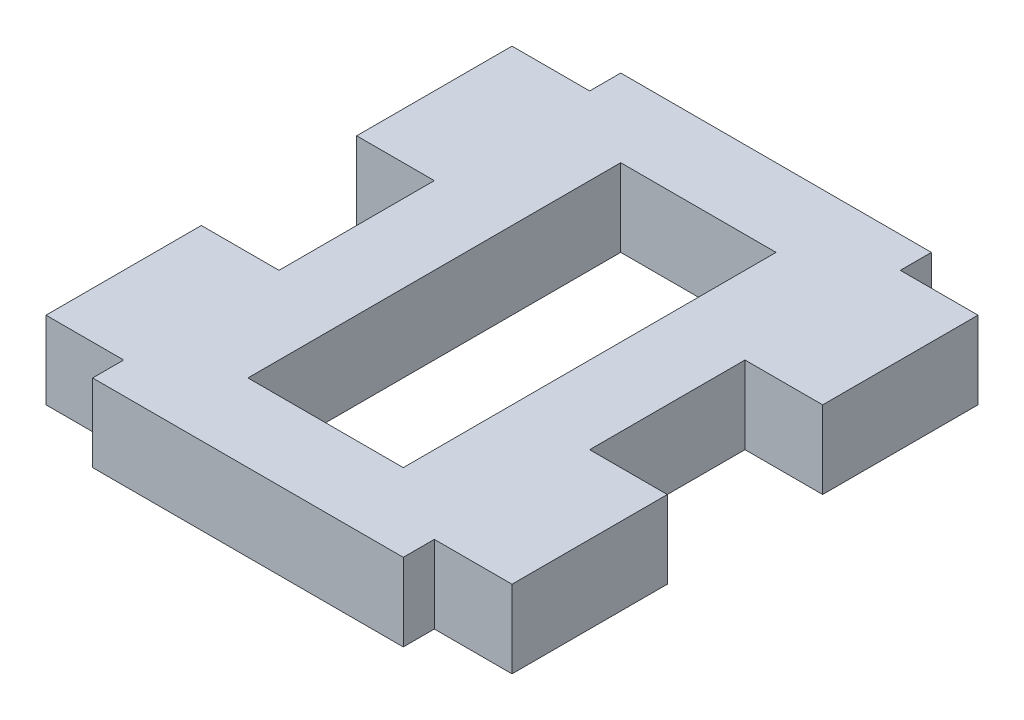
ISO-10303-21;
HEADER;
FILE_DESCRIPTION(('STEP AP214'),'2;1');
FILE_NAME('part.step','',(''),(''),'','','');
FILE_SCHEMA(('AUTOMOTIVE_DESIGN { 1 0 10303 214 1 1 1 1 }'));
ENDSEC;
DATA;
#1=APPLICATION_CONTEXT('core data for automotive mechanical design processes');
#2=APPLICATION_PROTOCOL_DEFINITION('international standard','automotive_design',2000,#1);
#3=PRODUCT_CONTEXT('',#1,'mechanical');
#4=PRODUCT('Part','Part','',(#3));
#5=PRODUCT_RELATED_PRODUCT_CATEGORY('part','',(#4));
#6=PRODUCT_DEFINITION_FORMATION('','',#4);
#7=PRODUCT_DEFINITION_CONTEXT('part definition',#1,'design');
#8=PRODUCT_DEFINITION('design','',#6,#7);
#9=PRODUCT_DEFINITION_SHAPE('','',#8);
#10=(LENGTH_UNIT() NAMED_UNIT(*) SI_UNIT(.MILLI.,.METRE.));
#11=(NAMED_UNIT(*) PLANE_ANGLE_UNIT() SI_UNIT($,.RADIAN.));
#12=(NAMED_UNIT(*) SI_UNIT($,.STERADIAN.) SOLID_ANGLE_UNIT());
#13=UNCERTAINTY_MEASURE_WITH_UNIT(LENGTH_MEASURE(1.E-05),#10,'distance_accuracy_value','');
#14=(GEOMETRIC_REPRESENTATION_CONTEXT(3) GLOBAL_UNCERTAINTY_ASSIGNED_CONTEXT((#13)) GLOBAL_UNIT_ASSIGNED_CONTEXT((#10,
#11,#12)) REPRESENTATION_CONTEXT('',''));
#15=CARTESIAN_POINT('',(0.,0.,0.));
#16=DIRECTION('',(0.,0.,1.));
#17=DIRECTION('',(1.,0.,0.));
#18=AXIS2_PLACEMENT_3D('',#15,#16,#17);
#19=CARTESIAN_POINT('',(12.7,6.35,21.59));
#20=DIRECTION('',(-1.,0.,0.));
#21=DIRECTION('',(0.,0.,1.));
#22=AXIS2_PLACEMENT_3D('',#19,#20,#21);
#23=PLANE('',#22);
#24=DIRECTION('',(0.,-1.,0.));
#25=VECTOR('',#24,1.);
#26=CARTESIAN_POINT('',(12.7,20.5490316571237,-6.35000000000001));
#27=LINE('',#26,#25);
#28=CARTESIAN_POINT('',(12.7,6.35,-6.35000000000001));
#29=VERTEX_POINT('',#28);
#30=CARTESIAN_POINT('',(12.7,0.,-6.35000000000001));
#31=VERTEX_POINT('',#30);
#32=EDGE_CURVE('E276',#29,#31,#27,.T.);
#33=ORIENTED_EDGE('',*,*,#32,.F.);
#34=DIRECTION('',(0.,0.,-1.));
#35=VECTOR('',#34,1.);
#36=CARTESIAN_POINT('',(12.7,6.35,21.59));
#37=LINE('',#36,#35);
#38=CARTESIAN_POINT('',(12.7,6.35,6.35000000000001));
#39=VERTEX_POINT('',#38);
#40=EDGE_CURVE('E341',#39,#29,#37,.T.);
#41=ORIENTED_EDGE('',*,*,#40,.F.);
#42=DIRECTION('',(0.,-1.,0.));
#43=VECTOR('',#42,1.);
#44=CARTESIAN_POINT('',(12.7,20.5490316571237,6.35000000000001));
#45=LINE('',#44,#43);
#46=CARTESIAN_POINT('',(12.7,0.,6.35000000000001));
#47=VERTEX_POINT('',#46);
#48=EDGE_CURVE('E249',#39,#47,#45,.T.);
#49=ORIENTED_EDGE('',*,*,#48,.T.);
#50=DIRECTION('',(0.,0.,-1.));
#51=VECTOR('',#50,1.);
#52=CARTESIAN_POINT('',(12.7,0.,21.59));
#53=LINE('',#52,#51);
#54=EDGE_CURVE('E355',#47,#31,#53,.T.);
#55=ORIENTED_EDGE('',*,*,#54,.T.);
#56=EDGE_LOOP('',(#33,#41,#49,#55));
#57=FACE_BOUND('',#56,.T.);
#58=ADVANCED_FACE('F39',(#57),#23,.F.);
#59=DIRECTION('',(0.,-1.,0.));
#60=VECTOR('',#59,1.);
#61=CARTESIAN_POINT('',(12.7,20.5490316571237,19.05));
#62=LINE('',#61,#60);
#63=CARTESIAN_POINT('',(12.7,6.35,19.05));
#64=VERTEX_POINT('',#63);
#65=CARTESIAN_POINT('',(12.7,0.,19.05));
#66=VERTEX_POINT('',#65);
#67=EDGE_CURVE('E246',#64,#66,#62,.T.);
#68=ORIENTED_EDGE('',*,*,#67,.F.);
#69=CARTESIAN_POINT('',(12.7,6.35,21.59));
#70=VERTEX_POINT('',#69);
#71=EDGE_CURVE('E337',#70,#64,#37,.T.);
#72=ORIENTED_EDGE('',*,*,#71,.F.);
#73=DIRECTION('',(0.,-1.,0.));
#74=VECTOR('',#73,1.);
#75=CARTESIAN_POINT('',(12.7,6.35,21.59));
#76=LINE('',#75,#74);
#77=CARTESIAN_POINT('',(12.7,0.,21.59));
#78=VERTEX_POINT('',#77);
#79=EDGE_CURVE('E351',#70,#78,#76,.T.);
#80=ORIENTED_EDGE('',*,*,#79,.T.);
#81=EDGE_CURVE('E352',#78,#66,#53,.T.);
#82=ORIENTED_EDGE('',*,*,#81,.T.);
#83=EDGE_LOOP('',(#68,#72,#80,#82));
#84=FACE_BOUND('',#83,.T.);
#85=ADVANCED_FACE('F423',(#84),#23,.F.);
#86=CARTESIAN_POINT('',(-12.7,6.35,21.59));
#87=DIRECTION('',(1.,0.,0.));
#88=DIRECTION('',(0.,0.,-1.));
#89=AXIS2_PLACEMENT_3D('',#86,#87,#88);
#90=PLANE('',#89);
#91=DIRECTION('',(0.,-1.,0.));
#92=VECTOR('',#91,1.);
#93=CARTESIAN_POINT('',(-12.7,20.5490316571237,-19.05));
#94=LINE('',#93,#92);
#95=CARTESIAN_POINT('',(-12.7,6.35,-19.05));
#96=VERTEX_POINT('',#95);
#97=CARTESIAN_POINT('',(-12.7,0.,-19.05));
#98=VERTEX_POINT('',#97);
#99=EDGE_CURVE('E296',#96,#98,#94,.T.);
#100=ORIENTED_EDGE('',*,*,#99,.F.);
#101=DIRECTION('',(0.,0.,1.));
#102=VECTOR('',#101,1.);
#103=CARTESIAN_POINT('',(-12.7,6.35,21.59));
#104=LINE('',#103,#102);
#105=CARTESIAN_POINT('',(-12.7,6.35,-21.59));
#106=VERTEX_POINT('',#105);
#107=EDGE_CURVE('E345',#106,#96,#104,.T.);
#108=ORIENTED_EDGE('',*,*,#107,.F.);
#109=DIRECTION('',(0.,-1.,0.));
#110=VECTOR('',#109,1.);
#111=CARTESIAN_POINT('',(-12.7,6.35,-21.59));
#112=LINE('',#111,#110);
#113=CARTESIAN_POINT('',(-12.7,0.,-21.59));
#114=VERTEX_POINT('',#113);
#115=EDGE_CURVE('E47',#106,#114,#112,.T.);
#116=ORIENTED_EDGE('',*,*,#115,.T.);
#117=DIRECTION('',(0.,0.,1.));
#118=VECTOR('',#117,1.);
#119=CARTESIAN_POINT('',(-12.7,0.,21.59));
#120=LINE('',#119,#118);
#121=EDGE_CURVE('E358',#114,#98,#120,.T.);
#122=ORIENTED_EDGE('',*,*,#121,.T.);
#123=EDGE_LOOP('',(#100,#108,#116,#122));
#124=FACE_BOUND('',#123,.T.);
#125=ADVANCED_FACE('F372',(#124),#90,.F.);
#126=CARTESIAN_POINT('',(-12.7,6.35,-6.35));
#127=VERTEX_POINT('',#126);
#128=CARTESIAN_POINT('',(-12.7,6.35,6.35));
#129=VERTEX_POINT('',#128);
#130=EDGE_CURVE('E349',#127,#129,#104,.T.);
#131=ORIENTED_EDGE('',*,*,#130,.F.);
#132=DIRECTION('',(0.,-1.,0.));
#133=VECTOR('',#132,1.);
#134=CARTESIAN_POINT('',(-12.7,20.5490316571237,-6.35));
#135=LINE('',#134,#133);
#136=CARTESIAN_POINT('',(-12.7,0.,-6.35));
#137=VERTEX_POINT('',#136);
#138=EDGE_CURVE('E299',#127,#137,#135,.T.);
#139=ORIENTED_EDGE('',*,*,#138,.T.);
#140=CARTESIAN_POINT('',(-12.7,0.,6.35));
#141=VERTEX_POINT('',#140);
#142=EDGE_CURVE('E361',#137,#141,#120,.T.);
#143=ORIENTED_EDGE('',*,*,#142,.T.);
#144=DIRECTION('',(0.,-1.,0.));
#145=VECTOR('',#144,1.);
#146=CARTESIAN_POINT('',(-12.7,20.5490316571237,6.35));
#147=LINE('',#146,#145);
#148=EDGE_CURVE('E315',#129,#141,#147,.T.);
#149=ORIENTED_EDGE('',*,*,#148,.F.);
#150=EDGE_LOOP('',(#131,#139,#143,#149));
#151=FACE_BOUND('',#150,.T.);
#152=ADVANCED_FACE('F450',(#151),#90,.F.);
#153=CARTESIAN_POINT('',(12.7,6.35,-19.05));
#154=VERTEX_POINT('',#153);
#155=CARTESIAN_POINT('',(12.7,6.35,-21.59));
#156=VERTEX_POINT('',#155);
#157=EDGE_CURVE('E342',#154,#156,#37,.T.);
#158=ORIENTED_EDGE('',*,*,#157,.F.);
#159=DIRECTION('',(0.,-1.,0.));
#160=VECTOR('',#159,1.);
#161=CARTESIAN_POINT('',(12.7,20.5490316571237,-19.05));
#162=LINE('',#161,#160);
#163=CARTESIAN_POINT('',(12.7,0.,-19.05));
#164=VERTEX_POINT('',#163);
#165=EDGE_CURVE('E269',#154,#164,#162,.T.);
#166=ORIENTED_EDGE('',*,*,#165,.T.);
#167=CARTESIAN_POINT('',(12.7,0.,-21.59));
#168=VERTEX_POINT('',#167);
#169=EDGE_CURVE('E336',#164,#168,#53,.T.);
#170=ORIENTED_EDGE('',*,*,#169,.T.);
#171=DIRECTION('',(0.,-1.,0.));
#172=VECTOR('',#171,1.);
#173=CARTESIAN_POINT('',(12.7,6.35,-21.59));
#174=LINE('',#173,#172);
#175=EDGE_CURVE('E11',#156,#168,#174,.T.);
#176=ORIENTED_EDGE('',*,*,#175,.F.);
#177=EDGE_LOOP('',(#158,#166,#170,#176));
#178=FACE_BOUND('',#177,.T.);
#179=ADVANCED_FACE('F41',(#178),#23,.F.);
#180=CARTESIAN_POINT('',(-12.7,6.35,-21.59));
#181=DIRECTION('',(0.,0.,1.));
#182=DIRECTION('',(1.,0.,0.));
#183=AXIS2_PLACEMENT_3D('',#180,#181,#182);
#184=PLANE('',#183);
#185=DIRECTION('',(-1.,0.,0.));
#186=VECTOR('',#185,1.);
#187=CARTESIAN_POINT('',(-12.7,0.,-21.59));
#188=LINE('',#187,#186);
#189=EDGE_CURVE('E354',#168,#114,#188,.T.);
#190=ORIENTED_EDGE('',*,*,#189,.T.);
#191=ORIENTED_EDGE('',*,*,#115,.F.);
#192=DIRECTION('',(-1.,0.,0.));
#193=VECTOR('',#192,1.);
#194=CARTESIAN_POINT('',(-12.7,6.35,-21.59));
#195=LINE('',#194,#193);
#196=EDGE_CURVE('E340',#156,#106,#195,.T.);
#197=ORIENTED_EDGE('',*,*,#196,.F.);
#198=ORIENTED_EDGE('',*,*,#175,.T.);
#199=EDGE_LOOP('',(#190,#191,#197,#198));
#200=FACE_BOUND('',#199,.T.);
#201=ADVANCED_FACE('F388',(#200),#184,.F.);
#202=CARTESIAN_POINT('',(-12.7,6.35,19.05));
#203=VERTEX_POINT('',#202);
#204=CARTESIAN_POINT('',(-12.7,6.35,21.59));
#205=VERTEX_POINT('',#204);
#206=EDGE_CURVE('E344',#203,#205,#104,.T.);
#207=ORIENTED_EDGE('',*,*,#206,.F.);
#208=DIRECTION('',(0.,-1.,0.));
#209=VECTOR('',#208,1.);
#210=CARTESIAN_POINT('',(-12.7,20.5490316571237,19.05));
#211=LINE('',#210,#209);
#212=CARTESIAN_POINT('',(-12.7,0.,19.05));
#213=VERTEX_POINT('',#212);
#214=EDGE_CURVE('E326',#203,#213,#211,.T.);
#215=ORIENTED_EDGE('',*,*,#214,.T.);
#216=CARTESIAN_POINT('',(-12.7,0.,21.59));
#217=VERTEX_POINT('',#216);
#218=EDGE_CURVE('E357',#213,#217,#120,.T.);
#219=ORIENTED_EDGE('',*,*,#218,.T.);
#220=DIRECTION('',(0.,-1.,0.));
#221=VECTOR('',#220,1.);
#222=CARTESIAN_POINT('',(-12.7,6.35,21.59));
#223=LINE('',#222,#221);
#224=EDGE_CURVE('E365',#205,#217,#223,.T.);
#225=ORIENTED_EDGE('',*,*,#224,.F.);
#226=EDGE_LOOP('',(#207,#215,#219,#225));
#227=FACE_BOUND('',#226,.T.);
#228=ADVANCED_FACE('F479',(#227),#90,.F.);
#229=CARTESIAN_POINT('',(-12.7,6.35,21.59));
#230=DIRECTION('',(0.,0.,-1.));
#231=DIRECTION('',(-1.,0.,0.));
#232=AXIS2_PLACEMENT_3D('',#229,#230,#231);
#233=PLANE('',#232);
#234=DIRECTION('',(1.,0.,0.));
#235=VECTOR('',#234,1.);
#236=CARTESIAN_POINT('',(-12.7,0.,21.59));
#237=LINE('',#236,#235);
#238=EDGE_CURVE('E360',#217,#78,#237,.T.);
#239=ORIENTED_EDGE('',*,*,#238,.T.);
#240=ORIENTED_EDGE('',*,*,#79,.F.);
#241=DIRECTION('',(1.,0.,0.));
#242=VECTOR('',#241,1.);
#243=CARTESIAN_POINT('',(-12.7,6.35,21.59));
#244=LINE('',#243,#242);
#245=EDGE_CURVE('E348',#205,#70,#244,.T.);
#246=ORIENTED_EDGE('',*,*,#245,.F.);
#247=ORIENTED_EDGE('',*,*,#224,.T.);
#248=EDGE_LOOP('',(#239,#240,#246,#247));
#249=FACE_BOUND('',#248,.T.);
#250=ADVANCED_FACE('F428',(#249),#233,.F.);
#251=CARTESIAN_POINT('',(0.,6.35,0.));
#252=DIRECTION('',(0.,-1.,0.));
#253=DIRECTION('',(0.,0.,-1.));
#254=AXIS2_PLACEMENT_3D('',#251,#252,#253);
#255=PLANE('',#254);
#256=DIRECTION('',(1.,0.,0.));
#257=VECTOR('',#256,1.);
#258=CARTESIAN_POINT('',(-6.35,6.35,-15.24));
#259=LINE('',#258,#257);
#260=CARTESIAN_POINT('',(-6.35,6.35,-15.24));
#261=VERTEX_POINT('',#260);
#262=CARTESIAN_POINT('',(6.35,6.35,-15.24));
#263=VERTEX_POINT('',#262);
#264=EDGE_CURVE('E208',#261,#263,#259,.T.);
#265=ORIENTED_EDGE('',*,*,#264,.T.);
#266=DIRECTION('',(0.,0.,1.));
#267=VECTOR('',#266,1.);
#268=CARTESIAN_POINT('',(6.35,6.35,-15.24));
#269=LINE('',#268,#267);
#270=CARTESIAN_POINT('',(6.35,6.35,15.24));
#271=VERTEX_POINT('',#270);
#272=EDGE_CURVE('E202',#263,#271,#269,.T.);
#273=ORIENTED_EDGE('',*,*,#272,.T.);
#274=DIRECTION('',(-1.,0.,0.));
#275=VECTOR('',#274,1.);
#276=CARTESIAN_POINT('',(-6.35,6.35,15.24));
#277=LINE('',#276,#275);
#278=CARTESIAN_POINT('',(-6.35,6.35,15.24));
#279=VERTEX_POINT('',#278);
#280=EDGE_CURVE('E211',#271,#279,#277,.T.);
#281=ORIENTED_EDGE('',*,*,#280,.T.);
#282=DIRECTION('',(0.,0.,-1.));
#283=VECTOR('',#282,1.);
#284=CARTESIAN_POINT('',(-6.35,6.35,-15.24));
#285=LINE('',#284,#283);
#286=EDGE_CURVE('E54',#279,#261,#285,.T.);
#287=ORIENTED_EDGE('',*,*,#286,.T.);
#288=EDGE_LOOP('',(#265,#273,#281,#287));
#289=FACE_BOUND('',#288,.T.);
#290=ORIENTED_EDGE('',*,*,#71,.T.);
#291=DIRECTION('',(1.,0.,0.));
#292=VECTOR('',#291,1.);
#293=CARTESIAN_POINT('',(12.7,6.35,19.05));
#294=LINE('',#293,#292);
#295=CARTESIAN_POINT('',(19.05,6.35,19.05));
#296=VERTEX_POINT('',#295);
#297=EDGE_CURVE('E251',#64,#296,#294,.T.);
#298=ORIENTED_EDGE('',*,*,#297,.T.);
#299=DIRECTION('',(0.,0.,-1.));
#300=VECTOR('',#299,1.);
#301=CARTESIAN_POINT('',(19.05,6.35,19.05));
#302=LINE('',#301,#300);
#303=CARTESIAN_POINT('',(19.05,6.35,6.35000000000001));
#304=VERTEX_POINT('',#303);
#305=EDGE_CURVE('E237',#296,#304,#302,.T.);
#306=ORIENTED_EDGE('',*,*,#305,.T.);
#307=DIRECTION('',(-1.,0.,0.));
#308=VECTOR('',#307,1.);
#309=CARTESIAN_POINT('',(19.05,6.35,6.35000000000001));
#310=LINE('',#309,#308);
#311=EDGE_CURVE('E239',#304,#39,#310,.T.);
#312=ORIENTED_EDGE('',*,*,#311,.T.);
#313=ORIENTED_EDGE('',*,*,#40,.T.);
#314=DIRECTION('',(1.,0.,0.));
#315=VECTOR('',#314,1.);
#316=CARTESIAN_POINT('',(19.05,6.35,-6.35000000000001));
#317=LINE('',#316,#315);
#318=CARTESIAN_POINT('',(19.05,6.35,-6.35000000000001));
#319=VERTEX_POINT('',#318);
#320=EDGE_CURVE('E267',#29,#319,#317,.T.);
#321=ORIENTED_EDGE('',*,*,#320,.T.);
#322=DIRECTION('',(0.,0.,-1.));
#323=VECTOR('',#322,1.);
#324=CARTESIAN_POINT('',(19.05,6.35,-19.05));
#325=LINE('',#324,#323);
#326=CARTESIAN_POINT('',(19.05,6.35,-19.05));
#327=VERTEX_POINT('',#326);
#328=EDGE_CURVE('E279',#319,#327,#325,.T.);
#329=ORIENTED_EDGE('',*,*,#328,.T.);
#330=DIRECTION('',(-1.,0.,0.));
#331=VECTOR('',#330,1.);
#332=CARTESIAN_POINT('',(12.7,6.35,-19.05));
#333=LINE('',#332,#331);
#334=EDGE_CURVE('E264',#327,#154,#333,.T.);
#335=ORIENTED_EDGE('',*,*,#334,.T.);
#336=ORIENTED_EDGE('',*,*,#157,.T.);
#337=ORIENTED_EDGE('',*,*,#196,.T.);
#338=ORIENTED_EDGE('',*,*,#107,.T.);
#339=DIRECTION('',(-1.,0.,0.));
#340=VECTOR('',#339,1.);
#341=CARTESIAN_POINT('',(-12.7,6.35,-19.05));
#342=LINE('',#341,#340);
#343=CARTESIAN_POINT('',(-19.05,6.35,-19.05));
#344=VERTEX_POINT('',#343);
#345=EDGE_CURVE('E301',#96,#344,#342,.T.);
#346=ORIENTED_EDGE('',*,*,#345,.T.);
#347=DIRECTION('',(0.,0.,1.));
#348=VECTOR('',#347,1.);
#349=CARTESIAN_POINT('',(-19.05,6.35,-19.05));
#350=LINE('',#349,#348);
#351=CARTESIAN_POINT('',(-19.05,6.35,-6.35));
#352=VERTEX_POINT('',#351);
#353=EDGE_CURVE('E233',#344,#352,#350,.T.);
#354=ORIENTED_EDGE('',*,*,#353,.T.);
#355=DIRECTION('',(1.,0.,0.));
#356=VECTOR('',#355,1.);
#357=CARTESIAN_POINT('',(-19.05,6.35,-6.35));
#358=LINE('',#357,#356);
#359=EDGE_CURVE('E290',#352,#127,#358,.T.);
#360=ORIENTED_EDGE('',*,*,#359,.T.);
#361=ORIENTED_EDGE('',*,*,#130,.T.);
#362=DIRECTION('',(-1.,0.,0.));
#363=VECTOR('',#362,1.);
#364=CARTESIAN_POINT('',(-19.05,6.35,6.35));
#365=LINE('',#364,#363);
#366=CARTESIAN_POINT('',(-19.05,6.35,6.35));
#367=VERTEX_POINT('',#366);
#368=EDGE_CURVE('E314',#129,#367,#365,.T.);
#369=ORIENTED_EDGE('',*,*,#368,.T.);
#370=DIRECTION('',(0.,0.,1.));
#371=VECTOR('',#370,1.);
#372=CARTESIAN_POINT('',(-19.05,6.35,19.05));
#373=LINE('',#372,#371);
#374=CARTESIAN_POINT('',(-19.05,6.35,19.05));
#375=VERTEX_POINT('',#374);
#376=EDGE_CURVE('E312',#367,#375,#373,.T.);
#377=ORIENTED_EDGE('',*,*,#376,.T.);
#378=DIRECTION('',(1.,0.,0.));
#379=VECTOR('',#378,1.);
#380=CARTESIAN_POINT('',(-12.7,6.35,19.05));
#381=LINE('',#380,#379);
#382=EDGE_CURVE('E317',#375,#203,#381,.T.);
#383=ORIENTED_EDGE('',*,*,#382,.T.);
#384=ORIENTED_EDGE('',*,*,#206,.T.);
#385=ORIENTED_EDGE('',*,*,#245,.T.);
#386=EDGE_LOOP('',(#290,#298,#306,#312,#313,#321,#329,#335,#336,#337,#338,#346,#354,#360,#361,
#369,#377,#383,#384,#385));
#387=FACE_BOUND('',#386,.T.);
#388=ADVANCED_FACE('F215',(#289,#387),#255,.F.);
#389=CARTESIAN_POINT('',(0.,0.,0.));
#390=DIRECTION('',(0.,-1.,0.));
#391=DIRECTION('',(0.,0.,-1.));
#392=AXIS2_PLACEMENT_3D('',#389,#390,#391);
#393=PLANE('',#392);
#394=DIRECTION('',(0.,0.,1.));
#395=VECTOR('',#394,1.);
#396=CARTESIAN_POINT('',(6.35,0.,-15.24));
#397=LINE('',#396,#395);
#398=CARTESIAN_POINT('',(6.35,0.,-15.24));
#399=VERTEX_POINT('',#398);
#400=CARTESIAN_POINT('',(6.35,0.,15.24));
#401=VERTEX_POINT('',#400);
#402=EDGE_CURVE('E62',#399,#401,#397,.T.);
#403=ORIENTED_EDGE('',*,*,#402,.F.);
#404=DIRECTION('',(1.,0.,0.));
#405=VECTOR('',#404,1.);
#406=CARTESIAN_POINT('',(-6.35,0.,-15.24));
#407=LINE('',#406,#405);
#408=CARTESIAN_POINT('',(-6.35,0.,-15.24));
#409=VERTEX_POINT('',#408);
#410=EDGE_CURVE('E218',#409,#399,#407,.T.);
#411=ORIENTED_EDGE('',*,*,#410,.F.);
#412=DIRECTION('',(0.,0.,-1.));
#413=VECTOR('',#412,1.);
#414=CARTESIAN_POINT('',(-6.35,0.,-15.24));
#415=LINE('',#414,#413);
#416=CARTESIAN_POINT('',(-6.35,0.,15.24));
#417=VERTEX_POINT('',#416);
#418=EDGE_CURVE('E221',#417,#409,#415,.T.);
#419=ORIENTED_EDGE('',*,*,#418,.F.);
#420=DIRECTION('',(-1.,0.,0.));
#421=VECTOR('',#420,1.);
#422=CARTESIAN_POINT('',(-6.35,0.,15.24));
#423=LINE('',#422,#421);
#424=EDGE_CURVE('E227',#401,#417,#423,.T.);
#425=ORIENTED_EDGE('',*,*,#424,.F.);
#426=EDGE_LOOP('',(#403,#411,#419,#425));
#427=FACE_BOUND('',#426,.T.);
#428=ORIENTED_EDGE('',*,*,#81,.F.);
#429=ORIENTED_EDGE('',*,*,#238,.F.);
#430=ORIENTED_EDGE('',*,*,#218,.F.);
#431=DIRECTION('',(-1.,0.,0.));
#432=VECTOR('',#431,1.);
#433=CARTESIAN_POINT('',(-12.7,0.,19.05));
#434=LINE('',#433,#432);
#435=CARTESIAN_POINT('',(-19.05,0.,19.05));
#436=VERTEX_POINT('',#435);
#437=EDGE_CURVE('E260',#213,#436,#434,.T.);
#438=ORIENTED_EDGE('',*,*,#437,.T.);
#439=DIRECTION('',(0.,0.,-1.));
#440=VECTOR('',#439,1.);
#441=CARTESIAN_POINT('',(-19.05,0.,19.05));
#442=LINE('',#441,#440);
#443=CARTESIAN_POINT('',(-19.05,0.,6.35));
#444=VERTEX_POINT('',#443);
#445=EDGE_CURVE('E320',#436,#444,#442,.T.);
#446=ORIENTED_EDGE('',*,*,#445,.T.);
#447=DIRECTION('',(1.,0.,0.));
#448=VECTOR('',#447,1.);
#449=CARTESIAN_POINT('',(-19.05,0.,6.35));
#450=LINE('',#449,#448);
#451=EDGE_CURVE('E323',#444,#141,#450,.T.);
#452=ORIENTED_EDGE('',*,*,#451,.T.);
#453=ORIENTED_EDGE('',*,*,#142,.F.);
#454=DIRECTION('',(-1.,0.,0.));
#455=VECTOR('',#454,1.);
#456=CARTESIAN_POINT('',(-19.05,0.,-6.35));
#457=LINE('',#456,#455);
#458=CARTESIAN_POINT('',(-19.05,0.,-6.35));
#459=VERTEX_POINT('',#458);
#460=EDGE_CURVE('E268',#137,#459,#457,.T.);
#461=ORIENTED_EDGE('',*,*,#460,.T.);
#462=DIRECTION('',(0.,0.,-1.));
#463=VECTOR('',#462,1.);
#464=CARTESIAN_POINT('',(-19.05,0.,-19.05));
#465=LINE('',#464,#463);
#466=CARTESIAN_POINT('',(-19.05,0.,-19.05));
#467=VERTEX_POINT('',#466);
#468=EDGE_CURVE('E304',#459,#467,#465,.T.);
#469=ORIENTED_EDGE('',*,*,#468,.T.);
#470=DIRECTION('',(1.,0.,0.));
#471=VECTOR('',#470,1.);
#472=CARTESIAN_POINT('',(-12.7,0.,-19.05));
#473=LINE('',#472,#471);
#474=EDGE_CURVE('E293',#467,#98,#473,.T.);
#475=ORIENTED_EDGE('',*,*,#474,.T.);
#476=ORIENTED_EDGE('',*,*,#121,.F.);
#477=ORIENTED_EDGE('',*,*,#189,.F.);
#478=ORIENTED_EDGE('',*,*,#169,.F.);
#479=DIRECTION('',(1.,0.,0.));
#480=VECTOR('',#479,1.);
#481=CARTESIAN_POINT('',(12.7,0.,-19.05));
#482=LINE('',#481,#480);
#483=CARTESIAN_POINT('',(19.05,0.,-19.05));
#484=VERTEX_POINT('',#483);
#485=EDGE_CURVE('E240',#164,#484,#482,.T.);
#486=ORIENTED_EDGE('',*,*,#485,.T.);
#487=DIRECTION('',(0.,0.,1.));
#488=VECTOR('',#487,1.);
#489=CARTESIAN_POINT('',(19.05,0.,-19.05));
#490=LINE('',#489,#488);
#491=CARTESIAN_POINT('',(19.05,0.,-6.35000000000001));
#492=VERTEX_POINT('',#491);
#493=EDGE_CURVE('E282',#484,#492,#490,.T.);
#494=ORIENTED_EDGE('',*,*,#493,.T.);
#495=DIRECTION('',(-1.,0.,0.));
#496=VECTOR('',#495,1.);
#497=CARTESIAN_POINT('',(19.05,0.,-6.35000000000001));
#498=LINE('',#497,#496);
#499=EDGE_CURVE('E271',#492,#31,#498,.T.);
#500=ORIENTED_EDGE('',*,*,#499,.T.);
#501=ORIENTED_EDGE('',*,*,#54,.F.);
#502=DIRECTION('',(1.,0.,0.));
#503=VECTOR('',#502,1.);
#504=CARTESIAN_POINT('',(19.05,0.,6.35000000000001));
#505=LINE('',#504,#503);
#506=CARTESIAN_POINT('',(19.05,0.,6.35000000000001));
#507=VERTEX_POINT('',#506);
#508=EDGE_CURVE('E257',#47,#507,#505,.T.);
#509=ORIENTED_EDGE('',*,*,#508,.T.);
#510=DIRECTION('',(0.,0.,1.));
#511=VECTOR('',#510,1.);
#512=CARTESIAN_POINT('',(19.05,0.,19.05));
#513=LINE('',#512,#511);
#514=CARTESIAN_POINT('',(19.05,0.,19.05));
#515=VERTEX_POINT('',#514);
#516=EDGE_CURVE('E254',#507,#515,#513,.T.);
#517=ORIENTED_EDGE('',*,*,#516,.T.);
#518=DIRECTION('',(-1.,0.,0.));
#519=VECTOR('',#518,1.);
#520=CARTESIAN_POINT('',(12.7,0.,19.05));
#521=LINE('',#520,#519);
#522=EDGE_CURVE('E243',#515,#66,#521,.T.);
#523=ORIENTED_EDGE('',*,*,#522,.T.);
#524=EDGE_LOOP('',(#428,#429,#430,#438,#446,#452,#453,#461,#469,#475,#476,#477,#478,#486,#494,
#500,#501,#509,#517,#523));
#525=FACE_BOUND('',#524,.T.);
#526=ADVANCED_FACE('F378',(#427,#525),#393,.T.);
#527=CARTESIAN_POINT('',(-19.05,20.5490316571237,6.35));
#528=DIRECTION('',(0.,0.,-1.));
#529=DIRECTION('',(-1.,0.,0.));
#530=AXIS2_PLACEMENT_3D('',#527,#528,#529);
#531=PLANE('',#530);
#532=ORIENTED_EDGE('',*,*,#368,.F.);
#533=ORIENTED_EDGE('',*,*,#148,.T.);
#534=ORIENTED_EDGE('',*,*,#451,.F.);
#535=DIRECTION('',(0.,-1.,0.));
#536=VECTOR('',#535,1.);
#537=CARTESIAN_POINT('',(-19.05,20.5490316571237,6.35));
#538=LINE('',#537,#536);
#539=EDGE_CURVE('E329',#367,#444,#538,.T.);
#540=ORIENTED_EDGE('',*,*,#539,.F.);
#541=EDGE_LOOP('',(#532,#533,#534,#540));
#542=FACE_BOUND('',#541,.T.);
#543=ADVANCED_FACE('F447',(#542),#531,.T.);
#544=CARTESIAN_POINT('',(-19.05,20.5490316571237,19.05));
#545=DIRECTION('',(-1.,0.,0.));
#546=DIRECTION('',(0.,0.,1.));
#547=AXIS2_PLACEMENT_3D('',#544,#545,#546);
#548=PLANE('',#547);
#549=ORIENTED_EDGE('',*,*,#376,.F.);
#550=ORIENTED_EDGE('',*,*,#539,.T.);
#551=ORIENTED_EDGE('',*,*,#445,.F.);
#552=DIRECTION('',(0.,-1.,0.));
#553=VECTOR('',#552,1.);
#554=CARTESIAN_POINT('',(-19.05,20.5490316571237,19.05));
#555=LINE('',#554,#553);
#556=EDGE_CURVE('E331',#375,#436,#555,.T.);
#557=ORIENTED_EDGE('',*,*,#556,.F.);
#558=EDGE_LOOP('',(#549,#550,#551,#557));
#559=FACE_BOUND('',#558,.T.);
#560=ADVANCED_FACE('F441',(#559),#548,.T.);
#561=CARTESIAN_POINT('',(-12.7,20.5490316571237,19.05));
#562=DIRECTION('',(0.,0.,1.));
#563=DIRECTION('',(1.,0.,0.));
#564=AXIS2_PLACEMENT_3D('',#561,#562,#563);
#565=PLANE('',#564);
#566=ORIENTED_EDGE('',*,*,#382,.F.);
#567=ORIENTED_EDGE('',*,*,#556,.T.);
#568=ORIENTED_EDGE('',*,*,#437,.F.);
#569=ORIENTED_EDGE('',*,*,#214,.F.);
#570=EDGE_LOOP('',(#566,#567,#568,#569));
#571=FACE_BOUND('',#570,.T.);
#572=ADVANCED_FACE('F436',(#571),#565,.T.);
#573=CARTESIAN_POINT('',(-19.05,20.5490316571237,-6.35));
#574=DIRECTION('',(0.,0.,1.));
#575=DIRECTION('',(1.,0.,0.));
#576=AXIS2_PLACEMENT_3D('',#573,#574,#575);
#577=PLANE('',#576);
#578=ORIENTED_EDGE('',*,*,#359,.F.);
#579=DIRECTION('',(0.,-1.,0.));
#580=VECTOR('',#579,1.);
#581=CARTESIAN_POINT('',(-19.05,20.5490316571237,-6.35));
#582=LINE('',#581,#580);
#583=EDGE_CURVE('E291',#352,#459,#582,.T.);
#584=ORIENTED_EDGE('',*,*,#583,.T.);
#585=ORIENTED_EDGE('',*,*,#460,.F.);
#586=ORIENTED_EDGE('',*,*,#138,.F.);
#587=EDGE_LOOP('',(#578,#584,#585,#586));
#588=FACE_BOUND('',#587,.T.);
#589=ADVANCED_FACE('F456',(#588),#577,.T.);
#590=CARTESIAN_POINT('',(-12.7,20.5490316571237,-19.05));
#591=DIRECTION('',(0.,0.,-1.));
#592=DIRECTION('',(-1.,0.,0.));
#593=AXIS2_PLACEMENT_3D('',#590,#591,#592);
#594=PLANE('',#593);
#595=ORIENTED_EDGE('',*,*,#345,.F.);
#596=ORIENTED_EDGE('',*,*,#99,.T.);
#597=ORIENTED_EDGE('',*,*,#474,.F.);
#598=DIRECTION('',(0.,-1.,0.));
#599=VECTOR('',#598,1.);
#600=CARTESIAN_POINT('',(-19.05,20.5490316571237,-19.05));
#601=LINE('',#600,#599);
#602=EDGE_CURVE('E294',#344,#467,#601,.T.);
#603=ORIENTED_EDGE('',*,*,#602,.F.);
#604=EDGE_LOOP('',(#595,#596,#597,#603));
#605=FACE_BOUND('',#604,.T.);
#606=ADVANCED_FACE('F385',(#605),#594,.T.);
#607=CARTESIAN_POINT('',(-19.05,20.5490316571237,-19.05));
#608=DIRECTION('',(-1.,0.,0.));
#609=DIRECTION('',(0.,0.,1.));
#610=AXIS2_PLACEMENT_3D('',#607,#608,#609);
#611=PLANE('',#610);
#612=ORIENTED_EDGE('',*,*,#353,.F.);
#613=ORIENTED_EDGE('',*,*,#602,.T.);
#614=ORIENTED_EDGE('',*,*,#468,.F.);
#615=ORIENTED_EDGE('',*,*,#583,.F.);
#616=EDGE_LOOP('',(#612,#613,#614,#615));
#617=FACE_BOUND('',#616,.T.);
#618=ADVANCED_FACE('F458',(#617),#611,.T.);
#619=CARTESIAN_POINT('',(19.05,20.5490316571237,6.35000000000001));
#620=DIRECTION('',(0.,0.,-1.));
#621=DIRECTION('',(-1.,0.,0.));
#622=AXIS2_PLACEMENT_3D('',#619,#620,#621);
#623=PLANE('',#622);
#624=ORIENTED_EDGE('',*,*,#311,.F.);
#625=DIRECTION('',(0.,-1.,0.));
#626=VECTOR('',#625,1.);
#627=CARTESIAN_POINT('',(19.05,20.5490316571237,6.35000000000001));
#628=LINE('',#627,#626);
#629=EDGE_CURVE('E241',#304,#507,#628,.T.);
#630=ORIENTED_EDGE('',*,*,#629,.T.);
#631=ORIENTED_EDGE('',*,*,#508,.F.);
#632=ORIENTED_EDGE('',*,*,#48,.F.);
#633=EDGE_LOOP('',(#624,#630,#631,#632));
#634=FACE_BOUND('',#633,.T.);
#635=ADVANCED_FACE('F412',(#634),#623,.T.);
#636=CARTESIAN_POINT('',(12.7,20.5490316571237,19.05));
#637=DIRECTION('',(0.,0.,1.));
#638=DIRECTION('',(1.,0.,0.));
#639=AXIS2_PLACEMENT_3D('',#636,#637,#638);
#640=PLANE('',#639);
#641=ORIENTED_EDGE('',*,*,#297,.F.);
#642=ORIENTED_EDGE('',*,*,#67,.T.);
#643=ORIENTED_EDGE('',*,*,#522,.F.);
#644=DIRECTION('',(0.,-1.,0.));
#645=VECTOR('',#644,1.);
#646=CARTESIAN_POINT('',(19.05,20.5490316571237,19.05));
#647=LINE('',#646,#645);
#648=EDGE_CURVE('E244',#296,#515,#647,.T.);
#649=ORIENTED_EDGE('',*,*,#648,.F.);
#650=EDGE_LOOP('',(#641,#642,#643,#649));
#651=FACE_BOUND('',#650,.T.);
#652=ADVANCED_FACE('F420',(#651),#640,.T.);
#653=CARTESIAN_POINT('',(19.05,20.5490316571237,19.05));
#654=DIRECTION('',(1.,0.,0.));
#655=DIRECTION('',(0.,0.,-1.));
#656=AXIS2_PLACEMENT_3D('',#653,#654,#655);
#657=PLANE('',#656);
#658=ORIENTED_EDGE('',*,*,#305,.F.);
#659=ORIENTED_EDGE('',*,*,#648,.T.);
#660=ORIENTED_EDGE('',*,*,#516,.F.);
#661=ORIENTED_EDGE('',*,*,#629,.F.);
#662=EDGE_LOOP('',(#658,#659,#660,#661));
#663=FACE_BOUND('',#662,.T.);
#664=ADVANCED_FACE('F416',(#663),#657,.T.);
#665=CARTESIAN_POINT('',(19.05,20.5490316571237,-6.35000000000001));
#666=DIRECTION('',(0.,0.,1.));
#667=DIRECTION('',(1.,0.,0.));
#668=AXIS2_PLACEMENT_3D('',#665,#666,#667);
#669=PLANE('',#668);
#670=ORIENTED_EDGE('',*,*,#320,.F.);
#671=ORIENTED_EDGE('',*,*,#32,.T.);
#672=ORIENTED_EDGE('',*,*,#499,.F.);
#673=DIRECTION('',(0.,-1.,0.));
#674=VECTOR('',#673,1.);
#675=CARTESIAN_POINT('',(19.05,20.5490316571237,-6.35000000000001));
#676=LINE('',#675,#674);
#677=EDGE_CURVE('E274',#319,#492,#676,.T.);
#678=ORIENTED_EDGE('',*,*,#677,.F.);
#679=EDGE_LOOP('',(#670,#671,#672,#678));
#680=FACE_BOUND('',#679,.T.);
#681=ADVANCED_FACE('F400',(#680),#669,.T.);
#682=CARTESIAN_POINT('',(19.05,20.5490316571237,-19.05));
#683=DIRECTION('',(1.,0.,0.));
#684=DIRECTION('',(0.,0.,-1.));
#685=AXIS2_PLACEMENT_3D('',#682,#683,#684);
#686=PLANE('',#685);
#687=ORIENTED_EDGE('',*,*,#328,.F.);
#688=ORIENTED_EDGE('',*,*,#677,.T.);
#689=ORIENTED_EDGE('',*,*,#493,.F.);
#690=DIRECTION('',(0.,-1.,0.));
#691=VECTOR('',#690,1.);
#692=CARTESIAN_POINT('',(19.05,20.5490316571237,-19.05));
#693=LINE('',#692,#691);
#694=EDGE_CURVE('E272',#327,#484,#693,.T.);
#695=ORIENTED_EDGE('',*,*,#694,.F.);
#696=EDGE_LOOP('',(#687,#688,#689,#695));
#697=FACE_BOUND('',#696,.T.);
#698=ADVANCED_FACE('F406',(#697),#686,.T.);
#699=CARTESIAN_POINT('',(12.7,20.5490316571237,-19.05));
#700=DIRECTION('',(0.,0.,-1.));
#701=DIRECTION('',(-1.,0.,0.));
#702=AXIS2_PLACEMENT_3D('',#699,#700,#701);
#703=PLANE('',#702);
#704=ORIENTED_EDGE('',*,*,#334,.F.);
#705=ORIENTED_EDGE('',*,*,#694,.T.);
#706=ORIENTED_EDGE('',*,*,#485,.F.);
#707=ORIENTED_EDGE('',*,*,#165,.F.);
#708=EDGE_LOOP('',(#704,#705,#706,#707));
#709=FACE_BOUND('',#708,.T.);
#710=ADVANCED_FACE('F568',(#709),#703,.T.);
#711=CARTESIAN_POINT('',(6.35,6.35,-15.24));
#712=DIRECTION('',(1.,0.,0.));
#713=DIRECTION('',(0.,0.,-1.));
#714=AXIS2_PLACEMENT_3D('',#711,#712,#713);
#715=PLANE('',#714);
#716=ORIENTED_EDGE('',*,*,#402,.T.);
#717=DIRECTION('',(0.,-1.,0.));
#718=VECTOR('',#717,1.);
#719=CARTESIAN_POINT('',(6.35,6.35,15.24));
#720=LINE('',#719,#718);
#721=EDGE_CURVE('E198',#271,#401,#720,.T.);
#722=ORIENTED_EDGE('',*,*,#721,.F.);
#723=ORIENTED_EDGE('',*,*,#272,.F.);
#724=DIRECTION('',(0.,-1.,0.));
#725=VECTOR('',#724,1.);
#726=CARTESIAN_POINT('',(6.35,6.35,-15.24));
#727=LINE('',#726,#725);
#728=EDGE_CURVE('E231',#263,#399,#727,.T.);
#729=ORIENTED_EDGE('',*,*,#728,.T.);
#730=EDGE_LOOP('',(#716,#722,#723,#729));
#731=FACE_BOUND('',#730,.T.);
#732=ADVANCED_FACE('F200',(#731),#715,.F.);
#733=CARTESIAN_POINT('',(-6.35,6.35,-15.24));
#734=DIRECTION('',(0.,0.,-1.));
#735=DIRECTION('',(-1.,0.,0.));
#736=AXIS2_PLACEMENT_3D('',#733,#734,#735);
#737=PLANE('',#736);
#738=ORIENTED_EDGE('',*,*,#410,.T.);
#739=ORIENTED_EDGE('',*,*,#728,.F.);
#740=ORIENTED_EDGE('',*,*,#264,.F.);
#741=DIRECTION('',(0.,-1.,0.));
#742=VECTOR('',#741,1.);
#743=CARTESIAN_POINT('',(-6.35,6.35,-15.24));
#744=LINE('',#743,#742);
#745=EDGE_CURVE('E234',#261,#409,#744,.T.);
#746=ORIENTED_EDGE('',*,*,#745,.T.);
#747=EDGE_LOOP('',(#738,#739,#740,#746));
#748=FACE_BOUND('',#747,.T.);
#749=ADVANCED_FACE('F586',(#748),#737,.F.);
#750=CARTESIAN_POINT('',(-6.35,6.35,-15.24));
#751=DIRECTION('',(-1.,0.,0.));
#752=DIRECTION('',(0.,0.,1.));
#753=AXIS2_PLACEMENT_3D('',#750,#751,#752);
#754=PLANE('',#753);
#755=ORIENTED_EDGE('',*,*,#418,.T.);
#756=ORIENTED_EDGE('',*,*,#745,.F.);
#757=ORIENTED_EDGE('',*,*,#286,.F.);
#758=DIRECTION('',(0.,-1.,0.));
#759=VECTOR('',#758,1.);
#760=CARTESIAN_POINT('',(-6.35,6.35,15.24));
#761=LINE('',#760,#759);
#762=EDGE_CURVE('E207',#279,#417,#761,.T.);
#763=ORIENTED_EDGE('',*,*,#762,.T.);
#764=EDGE_LOOP('',(#755,#756,#757,#763));
#765=FACE_BOUND('',#764,.T.);
#766=ADVANCED_FACE('F595',(#765),#754,.F.);
#767=CARTESIAN_POINT('',(-6.35,6.35,15.24));
#768=DIRECTION('',(0.,0.,1.));
#769=DIRECTION('',(1.,0.,0.));
#770=AXIS2_PLACEMENT_3D('',#767,#768,#769);
#771=PLANE('',#770);
#772=ORIENTED_EDGE('',*,*,#424,.T.);
#773=ORIENTED_EDGE('',*,*,#762,.F.);
#774=ORIENTED_EDGE('',*,*,#280,.F.);
#775=ORIENTED_EDGE('',*,*,#721,.T.);
#776=EDGE_LOOP('',(#772,#773,#774,#775));
#777=FACE_BOUND('',#776,.T.);
#778=ADVANCED_FACE('F212',(#777),#771,.F.);
#779=CLOSED_SHELL('',(#58,#85,#125,#152,#179,#201,#228,#250,#388,#526,#543,#560,#572,#589,#606,
#618,#635,#652,#664,#681,#698,#710,#732,#749,#766,#778));
#780=MANIFOLD_SOLID_BREP('B2',#779);
#781=ADVANCED_BREP_SHAPE_REPRESENTATION('',(#18,#780),#14);
#782=SHAPE_DEFINITION_REPRESENTATION(#9,#781);
ENDSEC;
END-ISO-10303-21;
